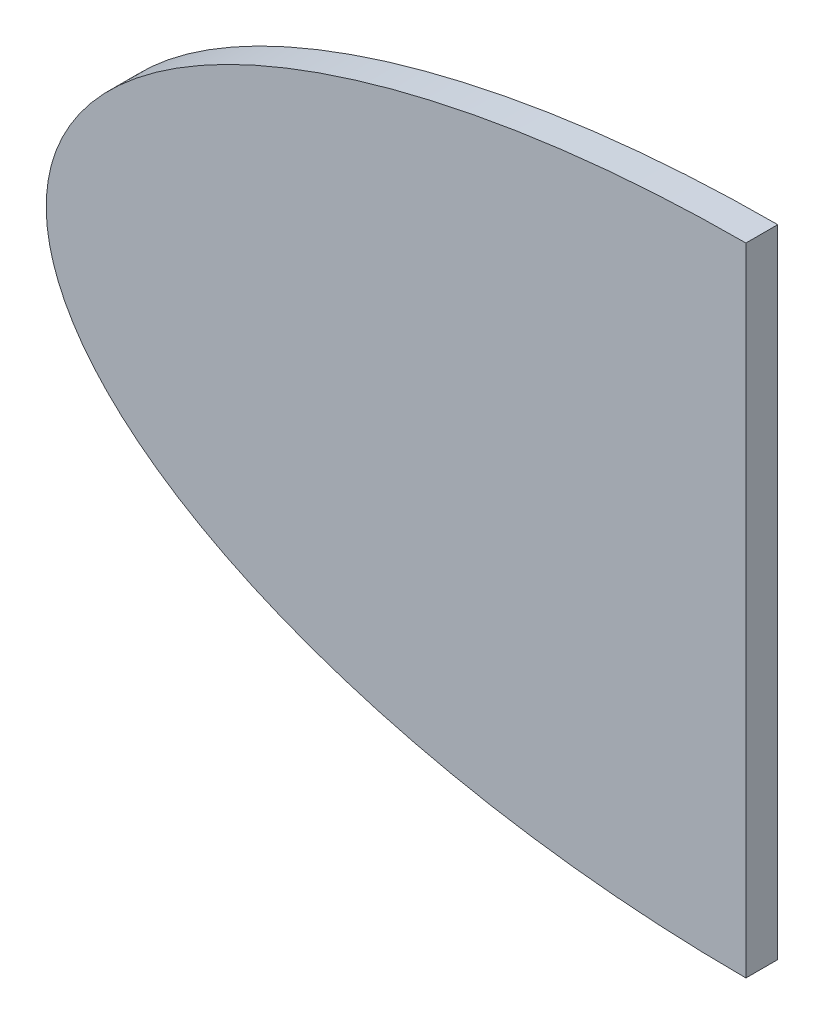
ISO-10303-21;
HEADER;
FILE_DESCRIPTION(('STEP AP214'),'2;1');
FILE_NAME('part.step','',(''),(''),'','','');
FILE_SCHEMA(('AUTOMOTIVE_DESIGN { 1 0 10303 214 1 1 1 1 }'));
ENDSEC;
DATA;
#1=APPLICATION_CONTEXT('core data for automotive mechanical design processes');
#2=APPLICATION_PROTOCOL_DEFINITION('international standard','automotive_design',2000,#1);
#3=PRODUCT_CONTEXT('',#1,'mechanical');
#4=PRODUCT('Part','Part','',(#3));
#5=PRODUCT_RELATED_PRODUCT_CATEGORY('part','',(#4));
#6=PRODUCT_DEFINITION_FORMATION('','',#4);
#7=PRODUCT_DEFINITION_CONTEXT('part definition',#1,'design');
#8=PRODUCT_DEFINITION('design','',#6,#7);
#9=PRODUCT_DEFINITION_SHAPE('','',#8);
#10=(LENGTH_UNIT() NAMED_UNIT(*) SI_UNIT(.MILLI.,.METRE.));
#11=(NAMED_UNIT(*) PLANE_ANGLE_UNIT() SI_UNIT($,.RADIAN.));
#12=(NAMED_UNIT(*) SI_UNIT($,.STERADIAN.) SOLID_ANGLE_UNIT());
#13=UNCERTAINTY_MEASURE_WITH_UNIT(LENGTH_MEASURE(1.E-05),#10,'distance_accuracy_value','');
#14=(GEOMETRIC_REPRESENTATION_CONTEXT(3) GLOBAL_UNCERTAINTY_ASSIGNED_CONTEXT((#13)) GLOBAL_UNIT_ASSIGNED_CONTEXT((#10,
#11,#12)) REPRESENTATION_CONTEXT('',''));
#15=CARTESIAN_POINT('',(0.,0.,0.));
#16=DIRECTION('',(0.,0.,1.));
#17=DIRECTION('',(1.,0.,0.));
#18=AXIS2_PLACEMENT_3D('',#15,#16,#17);
#19=CARTESIAN_POINT('',(0.,0.,0.));
#20=DIRECTION('',(1.,0.,0.));
#21=DIRECTION('',(0.,0.,-1.));
#22=AXIS2_PLACEMENT_3D('',#19,#20,#21);
#23=PLANE('',#22);
#24=DIRECTION('',(0.,-1.,0.));
#25=VECTOR('',#24,1.);
#26=CARTESIAN_POINT('',(0.,0.,23.));
#27=LINE('',#26,#25);
#28=CARTESIAN_POINT('',(1.66354280052359E-08,52.5007844550915,23.));
#29=VERTEX_POINT('',#28);
#30=CARTESIAN_POINT('',(1.93412212262928E-08,12.5007844550915,23.));
#31=VERTEX_POINT('',#30);
#32=EDGE_CURVE('E57',#29,#31,#27,.T.);
#33=ORIENTED_EDGE('',*,*,#32,.F.);
#34=DIRECTION('',(0.,0.,-1.));
#35=VECTOR('',#34,1.);
#36=CARTESIAN_POINT('',(0.,52.5007844550915,25.));
#37=LINE('',#36,#35);
#38=CARTESIAN_POINT('',(1.66354280052359E-08,52.5007844550915,25.));
#39=VERTEX_POINT('',#38);
#40=EDGE_CURVE('E70',#39,#29,#37,.T.);
#41=ORIENTED_EDGE('',*,*,#40,.F.);
#42=DIRECTION('',(0.,-1.,0.));
#43=VECTOR('',#42,1.);
#44=CARTESIAN_POINT('',(0.,0.,25.));
#45=LINE('',#44,#43);
#46=CARTESIAN_POINT('',(1.93412212262928E-08,12.5007844550915,25.));
#47=VERTEX_POINT('',#46);
#48=EDGE_CURVE('E75',#39,#47,#45,.T.);
#49=ORIENTED_EDGE('',*,*,#48,.T.);
#50=DIRECTION('',(0.,0.,-1.));
#51=VECTOR('',#50,1.);
#52=CARTESIAN_POINT('',(0.,12.5007844550915,25.));
#53=LINE('',#52,#51);
#54=EDGE_CURVE('E71',#31,#47,#53,.F.);
#55=ORIENTED_EDGE('',*,*,#54,.F.);
#56=EDGE_LOOP('',(#33,#41,#49,#55));
#57=FACE_BOUND('',#56,.T.);
#58=ADVANCED_FACE('F39',(#57),#23,.T.);
#59=CARTESIAN_POINT('',(27.2115518350807,16.7901833918851,25.));
#60=CARTESIAN_POINT('',(26.1635743822914,16.4146923791252,25.));
#61=CARTESIAN_POINT('',(24.0280398234519,15.7193898328845,25.));
#62=CARTESIAN_POINT('',(20.7276828958762,14.8343257213326,25.));
#63=CARTESIAN_POINT('',(17.3519272733949,14.0979927428733,25.));
#64=CARTESIAN_POINT('',(13.9196947460147,13.5052448137649,25.));
#65=CARTESIAN_POINT('',(11.0282050441213,13.1266540108488,25.));
#66=CARTESIAN_POINT('',(8.70530203786234,12.8910527405227,25.));
#67=CARTESIAN_POINT('',(6.9605357389715,12.7475004460819,25.));
#68=CARTESIAN_POINT('',(5.21544697405945,12.6366097822456,25.));
#69=CARTESIAN_POINT('',(3.47208023010814,12.5579526186037,25.));
#70=CARTESIAN_POINT('',(2.02241336676762,12.518909457056,25.));
#71=CARTESIAN_POINT('',(0.865585373557539,12.5033635475053,25.));
#72=CARTESIAN_POINT('',(0.288310250021773,12.5007844550915,25.));
#73=CARTESIAN_POINT('',(-0.28831025000316,12.5007844550915,25.));
#74=CARTESIAN_POINT('',(-0.86558539633713,12.5033635478211,25.));
#75=CARTESIAN_POINT('',(-2.02241351790937,12.5189094606385,25.));
#76=CARTESIAN_POINT('',(-3.47208068080839,12.5579526337818,25.));
#77=CARTESIAN_POINT('',(-5.21544795534321,12.6366098315877,25.));
#78=CARTESIAN_POINT('',(-6.96053737049609,12.747500558067,25.));
#79=CARTESIAN_POINT('',(-8.70530438782909,12.8910529518593,25.));
#80=CARTESIAN_POINT('',(-11.0282083678049,13.126654393477,25.));
#81=CARTESIAN_POINT('',(-13.9196991755686,13.505245464322,25.));
#82=CARTESIAN_POINT('',(-17.3519324011052,14.0979937403171,25.));
#83=CARTESIAN_POINT('',(-20.7276877487474,14.8343269027115,25.));
#84=CARTESIAN_POINT('',(-24.0280430843806,15.7193908469232,25.));
#85=CARTESIAN_POINT('',(-26.1635756365061,16.4146928285634,25.));
#86=CARTESIAN_POINT('',(-27.7078883596217,16.968021096072,25.));
#87=CARTESIAN_POINT('',(-28.6887424916489,17.3351599893894,25.));
#88=CARTESIAN_POINT('',(-30.1255632926588,17.9227260196778,25.));
#89=CARTESIAN_POINT('',(-31.5288925887231,18.5496071360901,25.));
#90=CARTESIAN_POINT('',(-32.8980939744131,19.2193456382678,25.));
#91=CARTESIAN_POINT('',(-34.2325310442999,19.9354838258525,25.));
#92=CARTESIAN_POINT('',(-35.5290759200076,20.7028482991812,25.));
#93=CARTESIAN_POINT('',(-36.7846007231602,21.526265658591,25.));
#94=CARTESIAN_POINT('',(-37.9925746265048,22.4123684508962,25.));
#95=CARTESIAN_POINT('',(-38.9541514400746,23.2085524275749,25.));
#96=CARTESIAN_POINT('',(-39.6894976663751,23.8842022808316,25.));
#97=CARTESIAN_POINT('',(-40.2223311335666,24.4113019272458,25.));
#98=CARTESIAN_POINT('',(-40.7347698079679,24.9597747506464,25.));
#99=CARTESIAN_POINT('',(-41.2237442858104,25.5305406108082,25.));
#100=CARTESIAN_POINT('',(-41.6861851633253,26.1245193675058,25.));
#101=CARTESIAN_POINT('',(-42.2633023278834,26.9486680515167,25.));
#102=CARTESIAN_POINT('',(-42.9030177639183,28.0414854467437,25.));
#103=CARTESIAN_POINT('',(-43.4986986695499,29.4479744294117,25.));
#104=CARTESIAN_POINT('',(-43.8811139714213,30.94446916453,25.));
#105=CARTESIAN_POINT('',(-43.9730414714184,31.979543078368,25.));
#106=CARTESIAN_POINT('',(-43.9730414714184,32.9939810258085,25.));
#107=CARTESIAN_POINT('',(-43.8905238331236,33.9821614225768,25.));
#108=CARTESIAN_POINT('',(-43.5367184939514,35.4345187389534,25.));
#109=CARTESIAN_POINT('',(-42.9704083062039,36.8216877317759,25.));
#110=CARTESIAN_POINT('',(-42.2269503379447,38.1320686914961,25.));
#111=CARTESIAN_POINT('',(-41.3417016572375,39.3540619085661,25.));
#112=CARTESIAN_POINT('',(-40.3397731774405,40.4908414767269,25.));
#113=CARTESIAN_POINT('',(-39.2462758119123,41.5455814897195,25.));
#114=CARTESIAN_POINT('',(-38.0770505409024,42.5240405743182,25.));
#115=CARTESIAN_POINT('',(-36.8479383446604,43.4319773572971,25.));
#116=CARTESIAN_POINT('',(-35.1416852458627,44.5558291368083,25.));
#117=CARTESIAN_POINT('',(-32.9056980461647,45.8117098735187,25.));
#118=CARTESIAN_POINT('',(-30.1060667864715,47.1140048939827,25.));
#119=CARTESIAN_POINT('',(-28.1832233779455,47.8632349634085,25.));
#120=CARTESIAN_POINT('',(-25.5522720393897,48.8059065638393,25.));
#121=CARTESIAN_POINT('',(-22.1524064779948,49.8488151875818,25.));
#122=CARTESIAN_POINT('',(-17.7654189987038,50.8320686600242,25.));
#123=CARTESIAN_POINT('',(-14.2036268820369,51.4433659914304,25.));
#124=CARTESIAN_POINT('',(-11.5127277291894,51.8170565821875,25.));
#125=CARTESIAN_POINT('',(-8.80881951226456,52.1088350806231,25.));
#126=CARTESIAN_POINT('',(-7.00144063551945,52.2500066110587,25.));
#127=CARTESIAN_POINT('',(-5.60352944061436,52.3390305253635,25.));
#128=CARTESIAN_POINT('',(-4.60221315789811,52.3949844632933,25.));
#129=CARTESIAN_POINT('',(-3.07312534851614,52.4559888292207,25.));
#130=CARTESIAN_POINT('',(-1.53236858173458,52.4927393677763,25.));
#131=CARTESIAN_POINT('',(-0.508468312741656,52.5007844550915,25.));
#132=CARTESIAN_POINT('',(0.508468312742994,52.5007844550915,25.));
#133=CARTESIAN_POINT('',(1.5323683750732,52.4927393278358,25.));
#134=CARTESIAN_POINT('',(3.07312657722668,52.4559887858293,25.));
#135=CARTESIAN_POINT('',(4.60221138643781,52.3949846330848,25.));
#136=CARTESIAN_POINT('',(5.60352944063818,52.3390305253621,25.));
#137=CARTESIAN_POINT('',(7.00144063544275,52.2500066110633,25.));
#138=CARTESIAN_POINT('',(8.80882167520319,52.108834918201,25.));
#139=CARTESIAN_POINT('',(11.5127371048002,51.8170555366219,25.));
#140=CARTESIAN_POINT('',(14.2036449169373,51.4433632710331,25.));
#141=CARTESIAN_POINT('',(17.765447232695,50.8320632294654,25.));
#142=CARTESIAN_POINT('',(22.1524387944482,49.8488065595949,25.));
#143=CARTESIAN_POINT('',(25.5522872949639,48.8059010976743,25.));
#144=CARTESIAN_POINT('',(28.1832313377422,47.8632321114565,25.));
#145=CARTESIAN_POINT('',(30.1060836996418,47.1139978592705,25.));
#146=CARTESIAN_POINT('',(32.905713555156,45.8117017880913,25.));
#147=CARTESIAN_POINT('',(35.1416925461597,44.5558244613517,25.));
#148=CARTESIAN_POINT('',(36.8479379094006,43.4319775105165,25.));
#149=CARTESIAN_POINT('',(38.0770444583574,42.5240451435585,25.));
#150=CARTESIAN_POINT('',(39.2462649751475,41.5455910136589,25.));
#151=CARTESIAN_POINT('',(40.3397590457255,40.4908559848758,25.));
#152=CARTESIAN_POINT('',(41.341686256046,39.354080921267,25.));
#153=CARTESIAN_POINT('',(42.2269358878044,38.1320908516031,25.));
#154=CARTESIAN_POINT('',(42.9703972226962,36.8217108046546,25.));
#155=CARTESIAN_POINT('',(43.5367120617146,35.4345392256459,25.));
#156=CARTESIAN_POINT('',(43.8905222058525,33.9821745598013,25.));
#157=CARTESIAN_POINT('',(43.9730414714184,32.9939859725693,25.));
#158=CARTESIAN_POINT('',(43.9730414714184,31.9795486003781,25.));
#159=CARTESIAN_POINT('',(43.8811158556465,30.9444838749247,25.));
#160=CARTESIAN_POINT('',(43.4987062844565,29.4479977851848,25.));
#161=CARTESIAN_POINT('',(42.9030312655178,28.0415127404049,25.));
#162=CARTESIAN_POINT('',(42.2633199825315,26.9486957721677,25.));
#163=CARTESIAN_POINT('',(41.6862051593717,26.124546357993,25.));
#164=CARTESIAN_POINT('',(41.2237655595175,25.5305666095001,25.));
#165=CARTESIAN_POINT('',(40.73479189308,24.9597994050761,25.));
#166=CARTESIAN_POINT('',(40.2223535759604,24.4113249766515,25.));
#167=CARTESIAN_POINT('',(39.6895200240595,23.884223556157,25.));
#168=CARTESIAN_POINT('',(38.9541731489515,23.2085711777288,25.));
#169=CARTESIAN_POINT('',(37.9925946198692,22.4123838682351,25.));
#170=CARTESIAN_POINT('',(36.7846175314634,21.5262771884555,25.));
#171=CARTESIAN_POINT('',(35.5290888292666,20.7028562376592,25.));
#172=CARTESIAN_POINT('',(34.2325397529947,19.9354886532166,25.));
#173=CARTESIAN_POINT('',(32.8980986151979,19.2193479459186,25.));
#174=CARTESIAN_POINT('',(31.5288937284263,18.5496076265562,25.));
#175=CARTESIAN_POINT('',(30.1255620303396,17.9227254580331,25.));
#176=CARTESIAN_POINT('',(28.688740458597,17.3351592032531,25.));
#177=CARTESIAN_POINT('',(27.7078873517485,16.9680207349751,25.));
#178=CARTESIAN_POINT('',(27.2115518350807,16.7901833918851,25.));
#179=B_SPLINE_CURVE_WITH_KNOTS('',3,(#59,#60,#61,#62,#63,#64,#65,#66,#67,#68,#69,#70,#71,#72,
#73,#74,#75,#76,#77,#78,#79,#80,#81,#82,#83,#84,#85,#86,#87,#88,#89,#90,#91,#92,#93,#94,#95,#96,
#97,#98,#99,#100,#101,#102,#103,#104,#105,#106,#107,#108,#109,#110,#111,#112,#113,#114,#115,
#116,#117,#118,#119,#120,#121,#122,#123,#124,#125,#126,#127,#128,#129,#130,#131,#132,#133,#134,
#135,#136,#137,#138,#139,#140,#141,#142,#143,#144,#145,#146,#147,#148,#149,#150,#151,#152,#153,
#154,#155,#156,#157,#158,#159,#160,#161,#162,#163,#164,#165,#166,#167,#168,#169,#170,#171,#172,
#173,#174,#175,#176,#177,#178),.UNSPECIFIED.,.T.,.F.,(4,1,1,1,1,1,1,1,1,1,1,1,2,1,1,1,1,1,1,1,1,
1,1,1,2,1,1,1,1,1,1,1,1,1,1,1,1,1,1,1,1,1,1,2,1,1,1,1,1,1,1,1,1,1,1,1,2,1,1,1,1,1,2,1,1,1,2,1,1,
1,2,1,1,1,1,1,2,1,1,1,1,1,1,1,1,1,1,1,1,2,1,1,1,1,1,1,1,1,1,1,1,1,1,1,1,1,1,1,4),(0.,
0.0163705035776675,0.0327410071553348,0.0491115107330021,0.0654820143106696,0.0818525178883369,
0.0900377696771707,0.0982230214660043,0.106408273254838,0.114593525043672,0.122778776832505,
0.126871402726922,0.130964028621339,0.135056654515492,0.139149280409644,0.147334532197949,
0.155519783986254,0.163705035774559,0.171890287562864,0.180075539351169,0.196446042927779,
0.212816546504389,0.229187050080999,0.24555755365761,0.26192805723422,0.269681202987183,
0.277434348740146,0.285187494493109,0.292940640246072,0.300693785999035,0.308446931751998,
0.316200077504961,0.323953223257924,0.331706369010887,0.335582941887368,0.33945951476385,
0.343336087640331,0.347212660516813,0.351089233393294,0.354965806269776,0.362718952022739,
0.370472097775702,0.378225243528665,0.385978389281628,0.393314536251811,0.400650683221995,
0.407986830192179,0.415322977162362,0.422659124132546,0.42999527110273,0.437331418072913,
0.444667565043097,0.45200371201328,0.459339858983464,0.474012152923831,0.488684446864199,
0.503356740804566,0.528411802134471,0.553466863464377,0.56599439412933,0.578521924794283,
0.591049455459236,0.603576986124189,0.610423524642466,0.617270063160743,0.62411660167902,
0.630963140197297,0.637809678715591,0.644656217233886,0.651502755752181,0.658349294270475,
0.67087682493386,0.683404355597245,0.695931886260631,0.708459416924016,0.733514478250786,
0.758569539577557,0.773241787652948,0.78791403572834,0.802586283803732,0.809922407841428,
0.817258531879124,0.82459465591682,0.831930779954515,0.839266903992211,0.846603028029907,
0.853939152067603,0.861275276105299,0.868611400142995,0.875947524180691,0.883700803919397,
0.891454083658104,0.899207363396811,0.906960643135518,0.910837283004871,0.914713922874225,
0.918590562743578,0.922467202612932,0.926343842482285,0.930220482351638,0.937973762090345,
0.945727041829052,0.953480321567759,0.961233601306466,0.968986881045173,0.976740160783879,
0.984493440522586,0.992246720261293,1.),.UNSPECIFIED.);
#180=DIRECTION('',(0.,0.,-1.));
#181=VECTOR('',#180,1.);
#182=SURFACE_OF_LINEAR_EXTRUSION('',#179,#181);
#183=CARTESIAN_POINT('',(27.2115518350807,16.7901833918851,23.));
#184=CARTESIAN_POINT('',(26.1635743822914,16.4146923791252,23.));
#185=CARTESIAN_POINT('',(24.0280398234519,15.7193898328845,23.));
#186=CARTESIAN_POINT('',(20.7276828958762,14.8343257213326,23.));
#187=CARTESIAN_POINT('',(17.3519272733949,14.0979927428733,23.));
#188=CARTESIAN_POINT('',(13.9196947460147,13.5052448137649,23.));
#189=CARTESIAN_POINT('',(11.0282050441213,13.1266540108488,23.));
#190=CARTESIAN_POINT('',(8.70530203786234,12.8910527405227,23.));
#191=CARTESIAN_POINT('',(6.9605357389715,12.7475004460819,23.));
#192=CARTESIAN_POINT('',(5.21544697405945,12.6366097822456,23.));
#193=CARTESIAN_POINT('',(3.47208023010814,12.5579526186037,23.));
#194=CARTESIAN_POINT('',(2.02241336676762,12.518909457056,23.));
#195=CARTESIAN_POINT('',(0.865585373557539,12.5033635475053,23.));
#196=CARTESIAN_POINT('',(0.288310250021773,12.5007844550915,23.));
#197=CARTESIAN_POINT('',(-0.28831025000316,12.5007844550915,23.));
#198=CARTESIAN_POINT('',(-0.86558539633713,12.5033635478211,23.));
#199=CARTESIAN_POINT('',(-2.02241351790937,12.5189094606385,23.));
#200=CARTESIAN_POINT('',(-3.47208068080839,12.5579526337818,23.));
#201=CARTESIAN_POINT('',(-5.21544795534321,12.6366098315877,23.));
#202=CARTESIAN_POINT('',(-6.96053737049609,12.747500558067,23.));
#203=CARTESIAN_POINT('',(-8.70530438782909,12.8910529518593,23.));
#204=CARTESIAN_POINT('',(-11.0282083678049,13.126654393477,23.));
#205=CARTESIAN_POINT('',(-13.9196991755686,13.505245464322,23.));
#206=CARTESIAN_POINT('',(-17.3519324011052,14.0979937403171,23.));
#207=CARTESIAN_POINT('',(-20.7276877487474,14.8343269027115,23.));
#208=CARTESIAN_POINT('',(-24.0280430843806,15.7193908469232,23.));
#209=CARTESIAN_POINT('',(-26.1635756365061,16.4146928285634,23.));
#210=CARTESIAN_POINT('',(-27.7078883596217,16.968021096072,23.));
#211=CARTESIAN_POINT('',(-28.6887424916489,17.3351599893894,23.));
#212=CARTESIAN_POINT('',(-30.1255632926588,17.9227260196778,23.));
#213=CARTESIAN_POINT('',(-31.5288925887231,18.5496071360901,23.));
#214=CARTESIAN_POINT('',(-32.8980939744131,19.2193456382678,23.));
#215=CARTESIAN_POINT('',(-34.2325310442999,19.9354838258525,23.));
#216=CARTESIAN_POINT('',(-35.5290759200076,20.7028482991812,23.));
#217=CARTESIAN_POINT('',(-36.7846007231602,21.526265658591,23.));
#218=CARTESIAN_POINT('',(-37.9925746265048,22.4123684508962,23.));
#219=CARTESIAN_POINT('',(-38.9541514400746,23.2085524275749,23.));
#220=CARTESIAN_POINT('',(-39.6894976663751,23.8842022808316,23.));
#221=CARTESIAN_POINT('',(-40.2223311335666,24.4113019272458,23.));
#222=CARTESIAN_POINT('',(-40.7347698079679,24.9597747506464,23.));
#223=CARTESIAN_POINT('',(-41.2237442858104,25.5305406108082,23.));
#224=CARTESIAN_POINT('',(-41.6861851633253,26.1245193675058,23.));
#225=CARTESIAN_POINT('',(-42.2633023278834,26.9486680515167,23.));
#226=CARTESIAN_POINT('',(-42.9030177639183,28.0414854467437,23.));
#227=CARTESIAN_POINT('',(-43.4986986695499,29.4479744294117,23.));
#228=CARTESIAN_POINT('',(-43.8811139714213,30.94446916453,23.));
#229=CARTESIAN_POINT('',(-43.9730414714184,31.979543078368,23.));
#230=CARTESIAN_POINT('',(-43.9730414714184,32.9939810258085,23.));
#231=CARTESIAN_POINT('',(-43.8905238331236,33.9821614225768,23.));
#232=CARTESIAN_POINT('',(-43.5367184939514,35.4345187389534,23.));
#233=CARTESIAN_POINT('',(-42.9704083062039,36.8216877317759,23.));
#234=CARTESIAN_POINT('',(-42.2269503379447,38.1320686914961,23.));
#235=CARTESIAN_POINT('',(-41.3417016572375,39.3540619085661,23.));
#236=CARTESIAN_POINT('',(-40.3397731774405,40.4908414767269,23.));
#237=CARTESIAN_POINT('',(-39.2462758119123,41.5455814897195,23.));
#238=CARTESIAN_POINT('',(-38.0770505409024,42.5240405743182,23.));
#239=CARTESIAN_POINT('',(-36.8479383446604,43.4319773572971,23.));
#240=CARTESIAN_POINT('',(-35.1416852458627,44.5558291368083,23.));
#241=CARTESIAN_POINT('',(-32.9056980461647,45.8117098735187,23.));
#242=CARTESIAN_POINT('',(-30.1060667864715,47.1140048939827,23.));
#243=CARTESIAN_POINT('',(-28.1832233779455,47.8632349634085,23.));
#244=CARTESIAN_POINT('',(-25.5522720393897,48.8059065638393,23.));
#245=CARTESIAN_POINT('',(-22.1524064779948,49.8488151875818,23.));
#246=CARTESIAN_POINT('',(-17.7654189987038,50.8320686600242,23.));
#247=CARTESIAN_POINT('',(-14.2036268820369,51.4433659914304,23.));
#248=CARTESIAN_POINT('',(-11.5127277291894,51.8170565821875,23.));
#249=CARTESIAN_POINT('',(-8.80881951226456,52.1088350806231,23.));
#250=CARTESIAN_POINT('',(-7.00144063551945,52.2500066110587,23.));
#251=CARTESIAN_POINT('',(-5.60352944061436,52.3390305253635,23.));
#252=CARTESIAN_POINT('',(-4.60221315789811,52.3949844632933,23.));
#253=CARTESIAN_POINT('',(-3.07312534851614,52.4559888292207,23.));
#254=CARTESIAN_POINT('',(-1.53236858173458,52.4927393677763,23.));
#255=CARTESIAN_POINT('',(-0.508468312741656,52.5007844550915,23.));
#256=CARTESIAN_POINT('',(0.508468312742994,52.5007844550915,23.));
#257=CARTESIAN_POINT('',(1.5323683750732,52.4927393278358,23.));
#258=CARTESIAN_POINT('',(3.07312657722668,52.4559887858293,23.));
#259=CARTESIAN_POINT('',(4.60221138643781,52.3949846330848,23.));
#260=CARTESIAN_POINT('',(5.60352944063818,52.3390305253621,23.));
#261=CARTESIAN_POINT('',(7.00144063544275,52.2500066110633,23.));
#262=CARTESIAN_POINT('',(8.80882167520319,52.108834918201,23.));
#263=CARTESIAN_POINT('',(11.5127371048002,51.8170555366219,23.));
#264=CARTESIAN_POINT('',(14.2036449169373,51.4433632710331,23.));
#265=CARTESIAN_POINT('',(17.765447232695,50.8320632294654,23.));
#266=CARTESIAN_POINT('',(22.1524387944482,49.8488065595949,23.));
#267=CARTESIAN_POINT('',(25.5522872949639,48.8059010976743,23.));
#268=CARTESIAN_POINT('',(28.1832313377422,47.8632321114565,23.));
#269=CARTESIAN_POINT('',(30.1060836996418,47.1139978592705,23.));
#270=CARTESIAN_POINT('',(32.905713555156,45.8117017880913,23.));
#271=CARTESIAN_POINT('',(35.1416925461597,44.5558244613517,23.));
#272=CARTESIAN_POINT('',(36.8479379094006,43.4319775105165,23.));
#273=CARTESIAN_POINT('',(38.0770444583574,42.5240451435585,23.));
#274=CARTESIAN_POINT('',(39.2462649751475,41.5455910136589,23.));
#275=CARTESIAN_POINT('',(40.3397590457255,40.4908559848758,23.));
#276=CARTESIAN_POINT('',(41.341686256046,39.354080921267,23.));
#277=CARTESIAN_POINT('',(42.2269358878044,38.1320908516031,23.));
#278=CARTESIAN_POINT('',(42.9703972226962,36.8217108046546,23.));
#279=CARTESIAN_POINT('',(43.5367120617146,35.4345392256459,23.));
#280=CARTESIAN_POINT('',(43.8905222058525,33.9821745598013,23.));
#281=CARTESIAN_POINT('',(43.9730414714184,32.9939859725693,23.));
#282=CARTESIAN_POINT('',(43.9730414714184,31.9795486003781,23.));
#283=CARTESIAN_POINT('',(43.8811158556465,30.9444838749247,23.));
#284=CARTESIAN_POINT('',(43.4987062844565,29.4479977851848,23.));
#285=CARTESIAN_POINT('',(42.9030312655178,28.0415127404049,23.));
#286=CARTESIAN_POINT('',(42.2633199825315,26.9486957721677,23.));
#287=CARTESIAN_POINT('',(41.6862051593717,26.124546357993,23.));
#288=CARTESIAN_POINT('',(41.2237655595175,25.5305666095001,23.));
#289=CARTESIAN_POINT('',(40.73479189308,24.9597994050761,23.));
#290=CARTESIAN_POINT('',(40.2223535759604,24.4113249766515,23.));
#291=CARTESIAN_POINT('',(39.6895200240595,23.884223556157,23.));
#292=CARTESIAN_POINT('',(38.9541731489515,23.2085711777288,23.));
#293=CARTESIAN_POINT('',(37.9925946198692,22.4123838682351,23.));
#294=CARTESIAN_POINT('',(36.7846175314634,21.5262771884555,23.));
#295=CARTESIAN_POINT('',(35.5290888292666,20.7028562376592,23.));
#296=CARTESIAN_POINT('',(34.2325397529947,19.9354886532166,23.));
#297=CARTESIAN_POINT('',(32.8980986151979,19.2193479459186,23.));
#298=CARTESIAN_POINT('',(31.5288937284263,18.5496076265562,23.));
#299=CARTESIAN_POINT('',(30.1255620303396,17.9227254580331,23.));
#300=CARTESIAN_POINT('',(28.688740458597,17.3351592032531,23.));
#301=CARTESIAN_POINT('',(27.7078873517485,16.9680207349751,23.));
#302=CARTESIAN_POINT('',(27.2115518350807,16.7901833918851,23.));
#303=B_SPLINE_CURVE_WITH_KNOTS('',3,(#183,#184,#185,#186,#187,#188,#189,#190,#191,#192,#193,
#194,#195,#196,#197,#198,#199,#200,#201,#202,#203,#204,#205,#206,#207,#208,#209,#210,#211,#212,
#213,#214,#215,#216,#217,#218,#219,#220,#221,#222,#223,#224,#225,#226,#227,#228,#229,#230,#231,
#232,#233,#234,#235,#236,#237,#238,#239,#240,#241,#242,#243,#244,#245,#246,#247,#248,#249,#250,
#251,#252,#253,#254,#255,#256,#257,#258,#259,#260,#261,#262,#263,#264,#265,#266,#267,#268,#269,
#270,#271,#272,#273,#274,#275,#276,#277,#278,#279,#280,#281,#282,#283,#284,#285,#286,#287,#288,
#289,#290,#291,#292,#293,#294,#295,#296,#297,#298,#299,#300,#301,#302),.UNSPECIFIED.,.T.,.F.,(4,
1,1,1,1,1,1,1,1,1,1,1,2,1,1,1,1,1,1,1,1,1,1,1,2,1,1,1,1,1,1,1,1,1,1,1,1,1,1,1,1,1,1,2,1,1,1,1,1,
1,1,1,1,1,1,1,2,1,1,1,1,1,2,1,1,1,2,1,1,1,2,1,1,1,1,1,2,1,1,1,1,1,1,1,1,1,1,1,1,2,1,1,1,1,1,1,1,
1,1,1,1,1,1,1,1,1,1,1,4),(0.,0.0163705035776675,0.0327410071553348,0.0491115107330021,
0.0654820143106696,0.0818525178883369,0.0900377696771707,0.0982230214660043,0.106408273254838,
0.114593525043672,0.122778776832505,0.126871402726922,0.130964028621339,0.135056654515492,
0.139149280409644,0.147334532197949,0.155519783986254,0.163705035774559,0.171890287562864,
0.180075539351169,0.196446042927779,0.212816546504389,0.229187050080999,0.24555755365761,
0.26192805723422,0.269681202987183,0.277434348740146,0.285187494493109,0.292940640246072,
0.300693785999035,0.308446931751998,0.316200077504961,0.323953223257924,0.331706369010887,
0.335582941887368,0.33945951476385,0.343336087640331,0.347212660516813,0.351089233393294,
0.354965806269776,0.362718952022739,0.370472097775702,0.378225243528665,0.385978389281628,
0.393314536251811,0.400650683221995,0.407986830192179,0.415322977162362,0.422659124132546,
0.42999527110273,0.437331418072913,0.444667565043097,0.45200371201328,0.459339858983464,
0.474012152923831,0.488684446864199,0.503356740804566,0.528411802134471,0.553466863464377,
0.56599439412933,0.578521924794283,0.591049455459236,0.603576986124189,0.610423524642466,
0.617270063160743,0.62411660167902,0.630963140197297,0.637809678715591,0.644656217233886,
0.651502755752181,0.658349294270475,0.67087682493386,0.683404355597245,0.695931886260631,
0.708459416924016,0.733514478250786,0.758569539577557,0.773241787652948,0.78791403572834,
0.802586283803732,0.809922407841428,0.817258531879124,0.82459465591682,0.831930779954515,
0.839266903992211,0.846603028029907,0.853939152067603,0.861275276105299,0.868611400142995,
0.875947524180691,0.883700803919397,0.891454083658104,0.899207363396811,0.906960643135518,
0.910837283004871,0.914713922874225,0.918590562743578,0.922467202612932,0.926343842482285,
0.930220482351638,0.937973762090345,0.945727041829052,0.953480321567759,0.961233601306466,
0.968986881045173,0.976740160783879,0.984493440522586,0.992246720261293,1.),.UNSPECIFIED.);
#304=EDGE_CURVE('E50',#29,#31,#303,.F.);
#305=ORIENTED_EDGE('',*,*,#304,.T.);
#306=ORIENTED_EDGE('',*,*,#54,.T.);
#307=CARTESIAN_POINT('',(27.2115518350807,16.7901833918851,25.));
#308=CARTESIAN_POINT('',(26.1635743822914,16.4146923791252,25.));
#309=CARTESIAN_POINT('',(24.0280398234519,15.7193898328845,25.));
#310=CARTESIAN_POINT('',(20.7276828958762,14.8343257213326,25.));
#311=CARTESIAN_POINT('',(17.3519272733949,14.0979927428733,25.));
#312=CARTESIAN_POINT('',(13.9196947460147,13.5052448137649,25.));
#313=CARTESIAN_POINT('',(11.0282050441213,13.1266540108488,25.));
#314=CARTESIAN_POINT('',(8.70530203786234,12.8910527405227,25.));
#315=CARTESIAN_POINT('',(6.9605357389715,12.7475004460819,25.));
#316=CARTESIAN_POINT('',(5.21544697405945,12.6366097822456,25.));
#317=CARTESIAN_POINT('',(3.47208023010814,12.5579526186037,25.));
#318=CARTESIAN_POINT('',(2.02241336676762,12.518909457056,25.));
#319=CARTESIAN_POINT('',(0.865585373557539,12.5033635475053,25.));
#320=CARTESIAN_POINT('',(0.288310250021773,12.5007844550915,25.));
#321=CARTESIAN_POINT('',(-0.28831025000316,12.5007844550915,25.));
#322=CARTESIAN_POINT('',(-0.86558539633713,12.5033635478211,25.));
#323=CARTESIAN_POINT('',(-2.02241351790937,12.5189094606385,25.));
#324=CARTESIAN_POINT('',(-3.47208068080839,12.5579526337818,25.));
#325=CARTESIAN_POINT('',(-5.21544795534321,12.6366098315877,25.));
#326=CARTESIAN_POINT('',(-6.96053737049609,12.747500558067,25.));
#327=CARTESIAN_POINT('',(-8.70530438782909,12.8910529518593,25.));
#328=CARTESIAN_POINT('',(-11.0282083678049,13.126654393477,25.));
#329=CARTESIAN_POINT('',(-13.9196991755686,13.505245464322,25.));
#330=CARTESIAN_POINT('',(-17.3519324011052,14.0979937403171,25.));
#331=CARTESIAN_POINT('',(-20.7276877487474,14.8343269027115,25.));
#332=CARTESIAN_POINT('',(-24.0280430843806,15.7193908469232,25.));
#333=CARTESIAN_POINT('',(-26.1635756365061,16.4146928285634,25.));
#334=CARTESIAN_POINT('',(-27.7078883596217,16.968021096072,25.));
#335=CARTESIAN_POINT('',(-28.6887424916489,17.3351599893894,25.));
#336=CARTESIAN_POINT('',(-30.1255632926588,17.9227260196778,25.));
#337=CARTESIAN_POINT('',(-31.5288925887231,18.5496071360901,25.));
#338=CARTESIAN_POINT('',(-32.8980939744131,19.2193456382678,25.));
#339=CARTESIAN_POINT('',(-34.2325310442999,19.9354838258525,25.));
#340=CARTESIAN_POINT('',(-35.5290759200076,20.7028482991812,25.));
#341=CARTESIAN_POINT('',(-36.7846007231602,21.526265658591,25.));
#342=CARTESIAN_POINT('',(-37.9925746265048,22.4123684508962,25.));
#343=CARTESIAN_POINT('',(-38.9541514400746,23.2085524275749,25.));
#344=CARTESIAN_POINT('',(-39.6894976663751,23.8842022808316,25.));
#345=CARTESIAN_POINT('',(-40.2223311335666,24.4113019272458,25.));
#346=CARTESIAN_POINT('',(-40.7347698079679,24.9597747506464,25.));
#347=CARTESIAN_POINT('',(-41.2237442858104,25.5305406108082,25.));
#348=CARTESIAN_POINT('',(-41.6861851633253,26.1245193675058,25.));
#349=CARTESIAN_POINT('',(-42.2633023278834,26.9486680515167,25.));
#350=CARTESIAN_POINT('',(-42.9030177639183,28.0414854467437,25.));
#351=CARTESIAN_POINT('',(-43.4986986695499,29.4479744294117,25.));
#352=CARTESIAN_POINT('',(-43.8811139714213,30.94446916453,25.));
#353=CARTESIAN_POINT('',(-43.9730414714184,31.979543078368,25.));
#354=CARTESIAN_POINT('',(-43.9730414714184,32.9939810258085,25.));
#355=CARTESIAN_POINT('',(-43.8905238331236,33.9821614225768,25.));
#356=CARTESIAN_POINT('',(-43.5367184939514,35.4345187389534,25.));
#357=CARTESIAN_POINT('',(-42.9704083062039,36.8216877317759,25.));
#358=CARTESIAN_POINT('',(-42.2269503379447,38.1320686914961,25.));
#359=CARTESIAN_POINT('',(-41.3417016572375,39.3540619085661,25.));
#360=CARTESIAN_POINT('',(-40.3397731774405,40.4908414767269,25.));
#361=CARTESIAN_POINT('',(-39.2462758119123,41.5455814897195,25.));
#362=CARTESIAN_POINT('',(-38.0770505409024,42.5240405743182,25.));
#363=CARTESIAN_POINT('',(-36.8479383446604,43.4319773572971,25.));
#364=CARTESIAN_POINT('',(-35.1416852458627,44.5558291368083,25.));
#365=CARTESIAN_POINT('',(-32.9056980461647,45.8117098735187,25.));
#366=CARTESIAN_POINT('',(-30.1060667864715,47.1140048939827,25.));
#367=CARTESIAN_POINT('',(-28.1832233779455,47.8632349634085,25.));
#368=CARTESIAN_POINT('',(-25.5522720393897,48.8059065638393,25.));
#369=CARTESIAN_POINT('',(-22.1524064779948,49.8488151875818,25.));
#370=CARTESIAN_POINT('',(-17.7654189987038,50.8320686600242,25.));
#371=CARTESIAN_POINT('',(-14.2036268820369,51.4433659914304,25.));
#372=CARTESIAN_POINT('',(-11.5127277291894,51.8170565821875,25.));
#373=CARTESIAN_POINT('',(-8.80881951226456,52.1088350806231,25.));
#374=CARTESIAN_POINT('',(-7.00144063551945,52.2500066110587,25.));
#375=CARTESIAN_POINT('',(-5.60352944061436,52.3390305253635,25.));
#376=CARTESIAN_POINT('',(-4.60221315789811,52.3949844632933,25.));
#377=CARTESIAN_POINT('',(-3.07312534851614,52.4559888292207,25.));
#378=CARTESIAN_POINT('',(-1.53236858173458,52.4927393677763,25.));
#379=CARTESIAN_POINT('',(-0.508468312741656,52.5007844550915,25.));
#380=CARTESIAN_POINT('',(0.508468312742994,52.5007844550915,25.));
#381=CARTESIAN_POINT('',(1.5323683750732,52.4927393278358,25.));
#382=CARTESIAN_POINT('',(3.07312657722668,52.4559887858293,25.));
#383=CARTESIAN_POINT('',(4.60221138643781,52.3949846330848,25.));
#384=CARTESIAN_POINT('',(5.60352944063818,52.3390305253621,25.));
#385=CARTESIAN_POINT('',(7.00144063544275,52.2500066110633,25.));
#386=CARTESIAN_POINT('',(8.80882167520319,52.108834918201,25.));
#387=CARTESIAN_POINT('',(11.5127371048002,51.8170555366219,25.));
#388=CARTESIAN_POINT('',(14.2036449169373,51.4433632710331,25.));
#389=CARTESIAN_POINT('',(17.765447232695,50.8320632294654,25.));
#390=CARTESIAN_POINT('',(22.1524387944482,49.8488065595949,25.));
#391=CARTESIAN_POINT('',(25.5522872949639,48.8059010976743,25.));
#392=CARTESIAN_POINT('',(28.1832313377422,47.8632321114565,25.));
#393=CARTESIAN_POINT('',(30.1060836996418,47.1139978592705,25.));
#394=CARTESIAN_POINT('',(32.905713555156,45.8117017880913,25.));
#395=CARTESIAN_POINT('',(35.1416925461597,44.5558244613517,25.));
#396=CARTESIAN_POINT('',(36.8479379094006,43.4319775105165,25.));
#397=CARTESIAN_POINT('',(38.0770444583574,42.5240451435585,25.));
#398=CARTESIAN_POINT('',(39.2462649751475,41.5455910136589,25.));
#399=CARTESIAN_POINT('',(40.3397590457255,40.4908559848758,25.));
#400=CARTESIAN_POINT('',(41.341686256046,39.354080921267,25.));
#401=CARTESIAN_POINT('',(42.2269358878044,38.1320908516031,25.));
#402=CARTESIAN_POINT('',(42.9703972226962,36.8217108046546,25.));
#403=CARTESIAN_POINT('',(43.5367120617146,35.4345392256459,25.));
#404=CARTESIAN_POINT('',(43.8905222058525,33.9821745598013,25.));
#405=CARTESIAN_POINT('',(43.9730414714184,32.9939859725693,25.));
#406=CARTESIAN_POINT('',(43.9730414714184,31.9795486003781,25.));
#407=CARTESIAN_POINT('',(43.8811158556465,30.9444838749247,25.));
#408=CARTESIAN_POINT('',(43.4987062844565,29.4479977851848,25.));
#409=CARTESIAN_POINT('',(42.9030312655178,28.0415127404049,25.));
#410=CARTESIAN_POINT('',(42.2633199825315,26.9486957721677,25.));
#411=CARTESIAN_POINT('',(41.6862051593717,26.124546357993,25.));
#412=CARTESIAN_POINT('',(41.2237655595175,25.5305666095001,25.));
#413=CARTESIAN_POINT('',(40.73479189308,24.9597994050761,25.));
#414=CARTESIAN_POINT('',(40.2223535759604,24.4113249766515,25.));
#415=CARTESIAN_POINT('',(39.6895200240595,23.884223556157,25.));
#416=CARTESIAN_POINT('',(38.9541731489515,23.2085711777288,25.));
#417=CARTESIAN_POINT('',(37.9925946198692,22.4123838682351,25.));
#418=CARTESIAN_POINT('',(36.7846175314634,21.5262771884555,25.));
#419=CARTESIAN_POINT('',(35.5290888292666,20.7028562376592,25.));
#420=CARTESIAN_POINT('',(34.2325397529947,19.9354886532166,25.));
#421=CARTESIAN_POINT('',(32.8980986151979,19.2193479459186,25.));
#422=CARTESIAN_POINT('',(31.5288937284263,18.5496076265562,25.));
#423=CARTESIAN_POINT('',(30.1255620303396,17.9227254580331,25.));
#424=CARTESIAN_POINT('',(28.688740458597,17.3351592032531,25.));
#425=CARTESIAN_POINT('',(27.7078873517485,16.9680207349751,25.));
#426=CARTESIAN_POINT('',(27.2115518350807,16.7901833918851,25.));
#427=B_SPLINE_CURVE_WITH_KNOTS('',3,(#307,#308,#309,#310,#311,#312,#313,#314,#315,#316,#317,
#318,#319,#320,#321,#322,#323,#324,#325,#326,#327,#328,#329,#330,#331,#332,#333,#334,#335,#336,
#337,#338,#339,#340,#341,#342,#343,#344,#345,#346,#347,#348,#349,#350,#351,#352,#353,#354,#355,
#356,#357,#358,#359,#360,#361,#362,#363,#364,#365,#366,#367,#368,#369,#370,#371,#372,#373,#374,
#375,#376,#377,#378,#379,#380,#381,#382,#383,#384,#385,#386,#387,#388,#389,#390,#391,#392,#393,
#394,#395,#396,#397,#398,#399,#400,#401,#402,#403,#404,#405,#406,#407,#408,#409,#410,#411,#412,
#413,#414,#415,#416,#417,#418,#419,#420,#421,#422,#423,#424,#425,#426),.UNSPECIFIED.,.T.,.F.,(4,
1,1,1,1,1,1,1,1,1,1,1,2,1,1,1,1,1,1,1,1,1,1,1,2,1,1,1,1,1,1,1,1,1,1,1,1,1,1,1,1,1,1,2,1,1,1,1,1,
1,1,1,1,1,1,1,2,1,1,1,1,1,2,1,1,1,2,1,1,1,2,1,1,1,1,1,2,1,1,1,1,1,1,1,1,1,1,1,1,2,1,1,1,1,1,1,1,
1,1,1,1,1,1,1,1,1,1,1,4),(0.,0.0163705035776675,0.0327410071553348,0.0491115107330021,
0.0654820143106696,0.0818525178883369,0.0900377696771707,0.0982230214660043,0.106408273254838,
0.114593525043672,0.122778776832505,0.126871402726922,0.130964028621339,0.135056654515492,
0.139149280409644,0.147334532197949,0.155519783986254,0.163705035774559,0.171890287562864,
0.180075539351169,0.196446042927779,0.212816546504389,0.229187050080999,0.24555755365761,
0.26192805723422,0.269681202987183,0.277434348740146,0.285187494493109,0.292940640246072,
0.300693785999035,0.308446931751998,0.316200077504961,0.323953223257924,0.331706369010887,
0.335582941887368,0.33945951476385,0.343336087640331,0.347212660516813,0.351089233393294,
0.354965806269776,0.362718952022739,0.370472097775702,0.378225243528665,0.385978389281628,
0.393314536251811,0.400650683221995,0.407986830192179,0.415322977162362,0.422659124132546,
0.42999527110273,0.437331418072913,0.444667565043097,0.45200371201328,0.459339858983464,
0.474012152923831,0.488684446864199,0.503356740804566,0.528411802134471,0.553466863464377,
0.56599439412933,0.578521924794283,0.591049455459236,0.603576986124189,0.610423524642466,
0.617270063160743,0.62411660167902,0.630963140197297,0.637809678715591,0.644656217233886,
0.651502755752181,0.658349294270475,0.67087682493386,0.683404355597245,0.695931886260631,
0.708459416924016,0.733514478250786,0.758569539577557,0.773241787652948,0.78791403572834,
0.802586283803732,0.809922407841428,0.817258531879124,0.82459465591682,0.831930779954515,
0.839266903992211,0.846603028029907,0.853939152067603,0.861275276105299,0.868611400142995,
0.875947524180691,0.883700803919397,0.891454083658104,0.899207363396811,0.906960643135518,
0.910837283004871,0.914713922874225,0.918590562743578,0.922467202612932,0.926343842482285,
0.930220482351638,0.937973762090345,0.945727041829052,0.953480321567759,0.961233601306466,
0.968986881045173,0.976740160783879,0.984493440522586,0.992246720261293,1.),.UNSPECIFIED.);
#428=EDGE_CURVE('E11',#39,#47,#427,.F.);
#429=ORIENTED_EDGE('',*,*,#428,.F.);
#430=ORIENTED_EDGE('',*,*,#40,.T.);
#431=EDGE_LOOP('',(#305,#306,#429,#430));
#432=FACE_BOUND('',#431,.T.);
#433=ADVANCED_FACE('F69',(#432),#182,.T.);
#434=CARTESIAN_POINT('',(0.,0.,23.));
#435=DIRECTION('',(0.,0.,-1.));
#436=DIRECTION('',(-1.,0.,0.));
#437=AXIS2_PLACEMENT_3D('',#434,#435,#436);
#438=PLANE('',#437);
#439=ORIENTED_EDGE('',*,*,#304,.F.);
#440=ORIENTED_EDGE('',*,*,#32,.T.);
#441=EDGE_LOOP('',(#439,#440));
#442=FACE_BOUND('',#441,.T.);
#443=ADVANCED_FACE('F41',(#442),#438,.T.);
#444=CARTESIAN_POINT('',(0.,0.,25.));
#445=DIRECTION('',(0.,0.,-1.));
#446=DIRECTION('',(-1.,0.,0.));
#447=AXIS2_PLACEMENT_3D('',#444,#445,#446);
#448=PLANE('',#447);
#449=ORIENTED_EDGE('',*,*,#48,.F.);
#450=ORIENTED_EDGE('',*,*,#428,.T.);
#451=EDGE_LOOP('',(#449,#450));
#452=FACE_BOUND('',#451,.T.);
#453=ADVANCED_FACE('F77',(#452),#448,.F.);
#454=CLOSED_SHELL('',(#58,#433,#443,#453));
#455=MANIFOLD_SOLID_BREP('B2',#454);
#456=ADVANCED_BREP_SHAPE_REPRESENTATION('',(#18,#455),#14);
#457=SHAPE_DEFINITION_REPRESENTATION(#9,#456);
ENDSEC;
END-ISO-10303-21;
